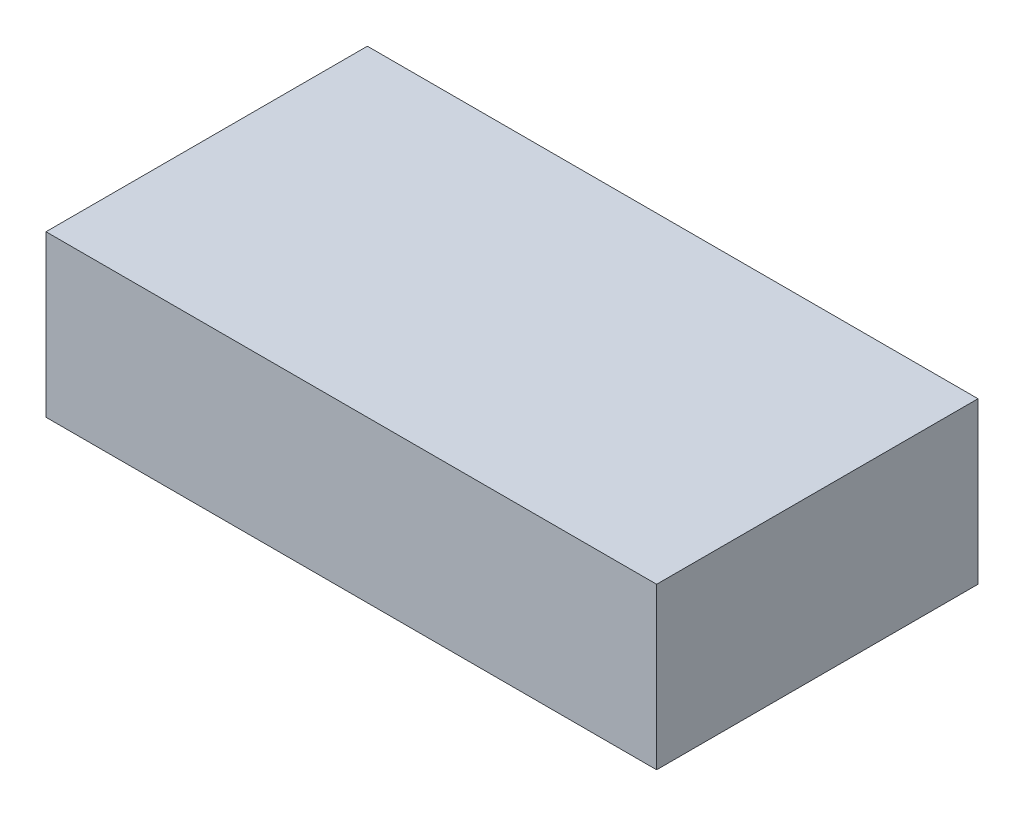
ISO-10303-21;
HEADER;
FILE_DESCRIPTION(('STEP AP214'),'2;1');
FILE_NAME('part.step','',(''),(''),'','','');
FILE_SCHEMA(('AUTOMOTIVE_DESIGN { 1 0 10303 214 1 1 1 1 }'));
ENDSEC;
DATA;
#1=APPLICATION_CONTEXT('core data for automotive mechanical design processes');
#2=APPLICATION_PROTOCOL_DEFINITION('international standard','automotive_design',2000,#1);
#3=PRODUCT_CONTEXT('',#1,'mechanical');
#4=PRODUCT('Part','Part','',(#3));
#5=PRODUCT_RELATED_PRODUCT_CATEGORY('part','',(#4));
#6=PRODUCT_DEFINITION_FORMATION('','',#4);
#7=PRODUCT_DEFINITION_CONTEXT('part definition',#1,'design');
#8=PRODUCT_DEFINITION('design','',#6,#7);
#9=PRODUCT_DEFINITION_SHAPE('','',#8);
#10=(LENGTH_UNIT() NAMED_UNIT(*) SI_UNIT(.MILLI.,.METRE.));
#11=(NAMED_UNIT(*) PLANE_ANGLE_UNIT() SI_UNIT($,.RADIAN.));
#12=(NAMED_UNIT(*) SI_UNIT($,.STERADIAN.) SOLID_ANGLE_UNIT());
#13=UNCERTAINTY_MEASURE_WITH_UNIT(LENGTH_MEASURE(1.E-05),#10,'distance_accuracy_value','');
#14=(GEOMETRIC_REPRESENTATION_CONTEXT(3) GLOBAL_UNCERTAINTY_ASSIGNED_CONTEXT((#13)) GLOBAL_UNIT_ASSIGNED_CONTEXT((#10,
#11,#12)) REPRESENTATION_CONTEXT('',''));
#15=CARTESIAN_POINT('',(0.,0.,0.));
#16=DIRECTION('',(0.,0.,1.));
#17=DIRECTION('',(1.,0.,0.));
#18=AXIS2_PLACEMENT_3D('',#15,#16,#17);
#19=CARTESIAN_POINT('',(27.5142028985507,20.,-58.7513043478261));
#20=DIRECTION('',(1.,0.,0.));
#21=DIRECTION('',(0.,0.,-1.));
#22=AXIS2_PLACEMENT_3D('',#19,#20,#21);
#23=PLANE('',#22);
#24=DIRECTION('',(0.,0.,1.));
#25=VECTOR('',#24,1.);
#26=CARTESIAN_POINT('',(27.5142028985507,0.,-58.7513043478261));
#27=LINE('',#26,#25);
#28=CARTESIAN_POINT('',(27.5142028985507,0.,-58.7513043478261));
#29=VERTEX_POINT('',#28);
#30=CARTESIAN_POINT('',(27.5142028985507,0.,-18.7513043478261));
#31=VERTEX_POINT('',#30);
#32=EDGE_CURVE('E106',#29,#31,#27,.T.);
#33=ORIENTED_EDGE('',*,*,#32,.T.);
#34=DIRECTION('',(0.,-1.,0.));
#35=VECTOR('',#34,1.);
#36=CARTESIAN_POINT('',(27.5142028985507,20.,-18.7513043478261));
#37=LINE('',#36,#35);
#38=CARTESIAN_POINT('',(27.5142028985507,20.,-18.7513043478261));
#39=VERTEX_POINT('',#38);
#40=EDGE_CURVE('E11',#39,#31,#37,.T.);
#41=ORIENTED_EDGE('',*,*,#40,.F.);
#42=DIRECTION('',(0.,0.,1.));
#43=VECTOR('',#42,1.);
#44=CARTESIAN_POINT('',(27.5142028985507,20.,-58.7513043478261));
#45=LINE('',#44,#43);
#46=CARTESIAN_POINT('',(27.5142028985507,20.,-58.7513043478261));
#47=VERTEX_POINT('',#46);
#48=EDGE_CURVE('E90',#47,#39,#45,.T.);
#49=ORIENTED_EDGE('',*,*,#48,.F.);
#50=DIRECTION('',(0.,-1.,0.));
#51=VECTOR('',#50,1.);
#52=CARTESIAN_POINT('',(27.5142028985507,20.,-58.7513043478261));
#53=LINE('',#52,#51);
#54=EDGE_CURVE('E102',#47,#29,#53,.T.);
#55=ORIENTED_EDGE('',*,*,#54,.T.);
#56=EDGE_LOOP('',(#33,#41,#49,#55));
#57=FACE_BOUND('',#56,.T.);
#58=ADVANCED_FACE('F38',(#57),#23,.F.);
#59=CARTESIAN_POINT('',(27.5142028985507,20.,-18.7513043478261));
#60=DIRECTION('',(0.,0.,-1.));
#61=DIRECTION('',(-1.,0.,0.));
#62=AXIS2_PLACEMENT_3D('',#59,#60,#61);
#63=PLANE('',#62);
#64=DIRECTION('',(1.,0.,0.));
#65=VECTOR('',#64,1.);
#66=CARTESIAN_POINT('',(27.5142028985507,0.,-18.7513043478261));
#67=LINE('',#66,#65);
#68=CARTESIAN_POINT('',(103.514202898551,0.,-18.7513043478261));
#69=VERTEX_POINT('',#68);
#70=EDGE_CURVE('E95',#31,#69,#67,.T.);
#71=ORIENTED_EDGE('',*,*,#70,.T.);
#72=DIRECTION('',(0.,-1.,0.));
#73=VECTOR('',#72,1.);
#74=CARTESIAN_POINT('',(103.514202898551,20.,-18.7513043478261));
#75=LINE('',#74,#73);
#76=CARTESIAN_POINT('',(103.514202898551,20.,-18.7513043478261));
#77=VERTEX_POINT('',#76);
#78=EDGE_CURVE('E47',#77,#69,#75,.T.);
#79=ORIENTED_EDGE('',*,*,#78,.F.);
#80=DIRECTION('',(1.,0.,0.));
#81=VECTOR('',#80,1.);
#82=CARTESIAN_POINT('',(27.5142028985507,20.,-18.7513043478261));
#83=LINE('',#82,#81);
#84=EDGE_CURVE('E85',#39,#77,#83,.T.);
#85=ORIENTED_EDGE('',*,*,#84,.F.);
#86=ORIENTED_EDGE('',*,*,#40,.T.);
#87=EDGE_LOOP('',(#71,#79,#85,#86));
#88=FACE_BOUND('',#87,.T.);
#89=ADVANCED_FACE('F94',(#88),#63,.F.);
#90=CARTESIAN_POINT('',(103.514202898551,20.,-58.7513043478261));
#91=DIRECTION('',(-1.,0.,0.));
#92=DIRECTION('',(0.,0.,1.));
#93=AXIS2_PLACEMENT_3D('',#90,#91,#92);
#94=PLANE('',#93);
#95=DIRECTION('',(0.,0.,-1.));
#96=VECTOR('',#95,1.);
#97=CARTESIAN_POINT('',(103.514202898551,0.,-58.7513043478261));
#98=LINE('',#97,#96);
#99=CARTESIAN_POINT('',(103.514202898551,0.,-58.7513043478261));
#100=VERTEX_POINT('',#99);
#101=EDGE_CURVE('E72',#69,#100,#98,.T.);
#102=ORIENTED_EDGE('',*,*,#101,.T.);
#103=DIRECTION('',(0.,-1.,0.));
#104=VECTOR('',#103,1.);
#105=CARTESIAN_POINT('',(103.514202898551,20.,-58.7513043478261));
#106=LINE('',#105,#104);
#107=CARTESIAN_POINT('',(103.514202898551,20.,-58.7513043478261));
#108=VERTEX_POINT('',#107);
#109=EDGE_CURVE('E97',#108,#100,#106,.T.);
#110=ORIENTED_EDGE('',*,*,#109,.F.);
#111=DIRECTION('',(0.,0.,-1.));
#112=VECTOR('',#111,1.);
#113=CARTESIAN_POINT('',(103.514202898551,20.,-58.7513043478261));
#114=LINE('',#113,#112);
#115=EDGE_CURVE('E88',#77,#108,#114,.T.);
#116=ORIENTED_EDGE('',*,*,#115,.F.);
#117=ORIENTED_EDGE('',*,*,#78,.T.);
#118=EDGE_LOOP('',(#102,#110,#116,#117));
#119=FACE_BOUND('',#118,.T.);
#120=ADVANCED_FACE('F98',(#119),#94,.F.);
#121=CARTESIAN_POINT('',(27.5142028985507,20.,-58.7513043478261));
#122=DIRECTION('',(0.,0.,1.));
#123=DIRECTION('',(1.,0.,0.));
#124=AXIS2_PLACEMENT_3D('',#121,#122,#123);
#125=PLANE('',#124);
#126=DIRECTION('',(-1.,0.,0.));
#127=VECTOR('',#126,1.);
#128=CARTESIAN_POINT('',(27.5142028985507,0.,-58.7513043478261));
#129=LINE('',#128,#127);
#130=EDGE_CURVE('E78',#100,#29,#129,.T.);
#131=ORIENTED_EDGE('',*,*,#130,.T.);
#132=ORIENTED_EDGE('',*,*,#54,.F.);
#133=DIRECTION('',(-1.,0.,0.));
#134=VECTOR('',#133,1.);
#135=CARTESIAN_POINT('',(27.5142028985507,20.,-58.7513043478261));
#136=LINE('',#135,#134);
#137=EDGE_CURVE('E55',#108,#47,#136,.T.);
#138=ORIENTED_EDGE('',*,*,#137,.F.);
#139=ORIENTED_EDGE('',*,*,#109,.T.);
#140=EDGE_LOOP('',(#131,#132,#138,#139));
#141=FACE_BOUND('',#140,.T.);
#142=ADVANCED_FACE('F119',(#141),#125,.F.);
#143=CARTESIAN_POINT('',(0.,20.,0.));
#144=DIRECTION('',(0.,1.,0.));
#145=DIRECTION('',(0.,0.,1.));
#146=AXIS2_PLACEMENT_3D('',#143,#144,#145);
#147=PLANE('',#146);
#148=ORIENTED_EDGE('',*,*,#48,.T.);
#149=ORIENTED_EDGE('',*,*,#84,.T.);
#150=ORIENTED_EDGE('',*,*,#115,.T.);
#151=ORIENTED_EDGE('',*,*,#137,.T.);
#152=EDGE_LOOP('',(#148,#149,#150,#151));
#153=FACE_BOUND('',#152,.T.);
#154=ADVANCED_FACE('F86',(#153),#147,.T.);
#155=CARTESIAN_POINT('',(0.,0.,0.));
#156=DIRECTION('',(0.,1.,0.));
#157=DIRECTION('',(0.,0.,1.));
#158=AXIS2_PLACEMENT_3D('',#155,#156,#157);
#159=PLANE('',#158);
#160=ORIENTED_EDGE('',*,*,#32,.F.);
#161=ORIENTED_EDGE('',*,*,#130,.F.);
#162=ORIENTED_EDGE('',*,*,#101,.F.);
#163=ORIENTED_EDGE('',*,*,#70,.F.);
#164=EDGE_LOOP('',(#160,#161,#162,#163));
#165=FACE_BOUND('',#164,.T.);
#166=ADVANCED_FACE('F122',(#165),#159,.F.);
#167=CLOSED_SHELL('',(#58,#89,#120,#142,#154,#166));
#168=MANIFOLD_SOLID_BREP('B2',#167);
#169=ADVANCED_BREP_SHAPE_REPRESENTATION('',(#18,#168),#14);
#170=SHAPE_DEFINITION_REPRESENTATION(#9,#169);
ENDSEC;
END-ISO-10303-21;
